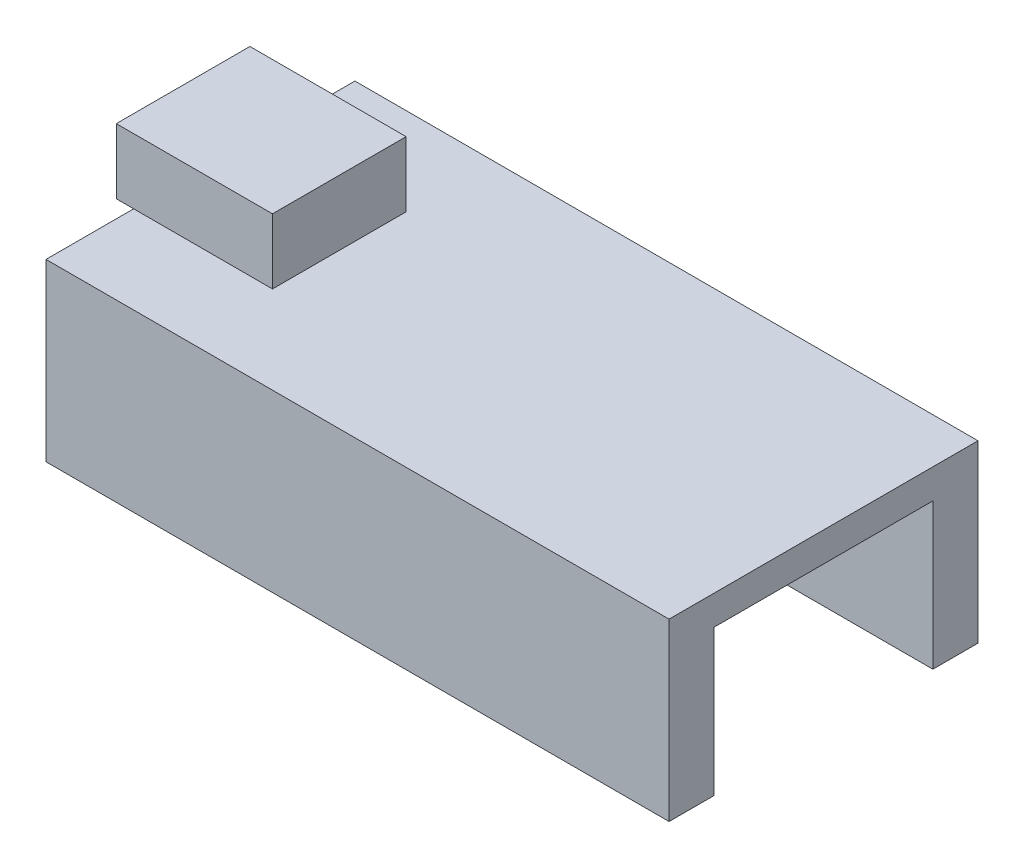
ISO-10303-21;
HEADER;
FILE_DESCRIPTION(('STEP AP214'),'2;1');
FILE_NAME('part.step','',(''),(''),'','','');
FILE_SCHEMA(('AUTOMOTIVE_DESIGN { 1 0 10303 214 1 1 1 1 }'));
ENDSEC;
DATA;
#1=APPLICATION_CONTEXT('core data for automotive mechanical design processes');
#2=APPLICATION_PROTOCOL_DEFINITION('international standard','automotive_design',2000,#1);
#3=PRODUCT_CONTEXT('',#1,'mechanical');
#4=PRODUCT('Part','Part','',(#3));
#5=PRODUCT_RELATED_PRODUCT_CATEGORY('part','',(#4));
#6=PRODUCT_DEFINITION_FORMATION('','',#4);
#7=PRODUCT_DEFINITION_CONTEXT('part definition',#1,'design');
#8=PRODUCT_DEFINITION('design','',#6,#7);
#9=PRODUCT_DEFINITION_SHAPE('','',#8);
#10=(LENGTH_UNIT() NAMED_UNIT(*) SI_UNIT(.MILLI.,.METRE.));
#11=(NAMED_UNIT(*) PLANE_ANGLE_UNIT() SI_UNIT($,.RADIAN.));
#12=(NAMED_UNIT(*) SI_UNIT($,.STERADIAN.) SOLID_ANGLE_UNIT());
#13=UNCERTAINTY_MEASURE_WITH_UNIT(LENGTH_MEASURE(1.E-05),#10,'distance_accuracy_value','');
#14=(GEOMETRIC_REPRESENTATION_CONTEXT(3) GLOBAL_UNCERTAINTY_ASSIGNED_CONTEXT((#13)) GLOBAL_UNIT_ASSIGNED_CONTEXT((#10,
#11,#12)) REPRESENTATION_CONTEXT('',''));
#15=CARTESIAN_POINT('',(0.,0.,0.));
#16=DIRECTION('',(0.,0.,1.));
#17=DIRECTION('',(1.,0.,0.));
#18=AXIS2_PLACEMENT_3D('',#15,#16,#17);
#19=CARTESIAN_POINT('',(-56.7067842729913,0.,-11.8636228267219));
#20=DIRECTION('',(0.,1.,0.));
#21=DIRECTION('',(0.,0.,1.));
#22=AXIS2_PLACEMENT_3D('',#19,#20,#21);
#23=PLANE('',#22);
#24=DIRECTION('',(-1.,0.,0.));
#25=VECTOR('',#24,1.);
#26=CARTESIAN_POINT('',(-56.7067842729913,0.,-27.0636228267219));
#27=LINE('',#26,#25);
#28=CARTESIAN_POINT('',(-20.8067842729913,0.,-27.0636228267219));
#29=VERTEX_POINT('',#28);
#30=CARTESIAN_POINT('',(-56.7067842729913,0.,-27.0636228267219));
#31=VERTEX_POINT('',#30);
#32=EDGE_CURVE('E153',#29,#31,#27,.T.);
#33=ORIENTED_EDGE('',*,*,#32,.F.);
#34=DIRECTION('',(0.,0.,-1.));
#35=VECTOR('',#34,1.);
#36=CARTESIAN_POINT('',(-20.8067842729913,0.,-29.6636228267219));
#37=LINE('',#36,#35);
#38=CARTESIAN_POINT('',(-20.8067842729913,0.,-14.4636228267219));
#39=VERTEX_POINT('',#38);
#40=EDGE_CURVE('E184',#39,#29,#37,.T.);
#41=ORIENTED_EDGE('',*,*,#40,.F.);
#42=DIRECTION('',(1.,0.,0.));
#43=VECTOR('',#42,1.);
#44=CARTESIAN_POINT('',(-56.7067842729913,0.,-14.4636228267219));
#45=LINE('',#44,#43);
#46=CARTESIAN_POINT('',(-56.7067842729913,0.,-14.4636228267219));
#47=VERTEX_POINT('',#46);
#48=EDGE_CURVE('E163',#47,#39,#45,.T.);
#49=ORIENTED_EDGE('',*,*,#48,.F.);
#50=DIRECTION('',(0.,0.,1.));
#51=VECTOR('',#50,1.);
#52=CARTESIAN_POINT('',(-56.7067842729913,0.,-29.6636228267219));
#53=LINE('',#52,#51);
#54=EDGE_CURVE('E34',#31,#47,#53,.T.);
#55=ORIENTED_EDGE('',*,*,#54,.F.);
#56=EDGE_LOOP('',(#33,#41,#49,#55));
#57=FACE_BOUND('',#56,.T.);
#58=ADVANCED_FACE('F30',(#57),#23,.F.);
#59=CARTESIAN_POINT('',(-56.7067842729913,1.7,-29.6636228267219));
#60=DIRECTION('',(1.,0.,0.));
#61=DIRECTION('',(0.,0.,-1.));
#62=AXIS2_PLACEMENT_3D('',#59,#60,#61);
#63=PLANE('',#62);
#64=DIRECTION('',(0.,-1.,0.));
#65=VECTOR('',#64,1.);
#66=CARTESIAN_POINT('',(-56.7067842729913,1.7,-29.6636228267219));
#67=LINE('',#66,#65);
#68=CARTESIAN_POINT('',(-56.7067842729913,1.7,-29.6636228267219));
#69=VERTEX_POINT('',#68);
#70=CARTESIAN_POINT('',(-56.7067842729913,-8.4,-29.6636228267219));
#71=VERTEX_POINT('',#70);
#72=EDGE_CURVE('E131',#69,#71,#67,.T.);
#73=ORIENTED_EDGE('',*,*,#72,.T.);
#74=DIRECTION('',(0.,0.,-1.));
#75=VECTOR('',#74,1.);
#76=CARTESIAN_POINT('',(-56.7067842729913,-8.4,-29.6636228267219));
#77=LINE('',#76,#75);
#78=CARTESIAN_POINT('',(-56.7067842729913,-8.4,-27.0636228267219));
#79=VERTEX_POINT('',#78);
#80=EDGE_CURVE('E134',#79,#71,#77,.T.);
#81=ORIENTED_EDGE('',*,*,#80,.F.);
#82=DIRECTION('',(0.,1.,0.));
#83=VECTOR('',#82,1.);
#84=CARTESIAN_POINT('',(-56.7067842729913,-8.4,-27.0636228267219));
#85=LINE('',#84,#83);
#86=EDGE_CURVE('E158',#79,#31,#85,.T.);
#87=ORIENTED_EDGE('',*,*,#86,.T.);
#88=ORIENTED_EDGE('',*,*,#54,.T.);
#89=DIRECTION('',(0.,1.,0.));
#90=VECTOR('',#89,1.);
#91=CARTESIAN_POINT('',(-56.7067842729913,-8.4,-14.4636228267219));
#92=LINE('',#91,#90);
#93=CARTESIAN_POINT('',(-56.7067842729913,-8.4,-14.4636228267219));
#94=VERTEX_POINT('',#93);
#95=EDGE_CURVE('E189',#94,#47,#92,.T.);
#96=ORIENTED_EDGE('',*,*,#95,.F.);
#97=DIRECTION('',(0.,0.,-1.));
#98=VECTOR('',#97,1.);
#99=CARTESIAN_POINT('',(-56.7067842729913,-8.4,-11.8636228267219));
#100=LINE('',#99,#98);
#101=CARTESIAN_POINT('',(-56.7067842729913,-8.4,-11.8636228267219));
#102=VERTEX_POINT('',#101);
#103=EDGE_CURVE('E164',#102,#94,#100,.T.);
#104=ORIENTED_EDGE('',*,*,#103,.F.);
#105=DIRECTION('',(0.,-1.,0.));
#106=VECTOR('',#105,1.);
#107=CARTESIAN_POINT('',(-56.7067842729913,1.7,-11.8636228267219));
#108=LINE('',#107,#106);
#109=CARTESIAN_POINT('',(-56.7067842729913,1.7,-11.8636228267219));
#110=VERTEX_POINT('',#109);
#111=EDGE_CURVE('E40',#110,#102,#108,.T.);
#112=ORIENTED_EDGE('',*,*,#111,.F.);
#113=DIRECTION('',(0.,0.,1.));
#114=VECTOR('',#113,1.);
#115=CARTESIAN_POINT('',(-56.7067842729913,1.7,-29.6636228267219));
#116=LINE('',#115,#114);
#117=CARTESIAN_POINT('',(-56.7067842729913,1.7,-16.9136228267219));
#118=VERTEX_POINT('',#117);
#119=EDGE_CURVE('E225',#118,#110,#116,.T.);
#120=ORIENTED_EDGE('',*,*,#119,.F.);
#121=CARTESIAN_POINT('',(-56.7067842729913,1.7,-24.6136228267219));
#122=VERTEX_POINT('',#121);
#123=EDGE_CURVE('E224',#122,#118,#116,.T.);
#124=ORIENTED_EDGE('',*,*,#123,.F.);
#125=EDGE_CURVE('E135',#69,#122,#116,.T.);
#126=ORIENTED_EDGE('',*,*,#125,.F.);
#127=EDGE_LOOP('',(#73,#81,#87,#88,#96,#104,#112,#120,#124,#126));
#128=FACE_BOUND('',#127,.T.);
#129=ADVANCED_FACE('F32',(#128),#63,.F.);
#130=CARTESIAN_POINT('',(-56.7067842729913,1.7,-11.8636228267219));
#131=DIRECTION('',(0.,0.,-1.));
#132=DIRECTION('',(-1.,0.,0.));
#133=AXIS2_PLACEMENT_3D('',#130,#131,#132);
#134=PLANE('',#133);
#135=ORIENTED_EDGE('',*,*,#111,.T.);
#136=DIRECTION('',(-1.,0.,0.));
#137=VECTOR('',#136,1.);
#138=CARTESIAN_POINT('',(-56.7067842729913,-8.4,-11.8636228267219));
#139=LINE('',#138,#137);
#140=CARTESIAN_POINT('',(-20.8067842729913,-8.4,-11.8636228267219));
#141=VERTEX_POINT('',#140);
#142=EDGE_CURVE('E172',#141,#102,#139,.T.);
#143=ORIENTED_EDGE('',*,*,#142,.F.);
#144=DIRECTION('',(0.,-1.,0.));
#145=VECTOR('',#144,1.);
#146=CARTESIAN_POINT('',(-20.8067842729913,1.7,-11.8636228267219));
#147=LINE('',#146,#145);
#148=CARTESIAN_POINT('',(-20.8067842729913,1.7,-11.8636228267219));
#149=VERTEX_POINT('',#148);
#150=EDGE_CURVE('E233',#149,#141,#147,.T.);
#151=ORIENTED_EDGE('',*,*,#150,.F.);
#152=DIRECTION('',(1.,0.,0.));
#153=VECTOR('',#152,1.);
#154=CARTESIAN_POINT('',(-56.7067842729913,1.7,-11.8636228267219));
#155=LINE('',#154,#153);
#156=EDGE_CURVE('E223',#110,#149,#155,.T.);
#157=ORIENTED_EDGE('',*,*,#156,.F.);
#158=EDGE_LOOP('',(#135,#143,#151,#157));
#159=FACE_BOUND('',#158,.T.);
#160=ADVANCED_FACE('F238',(#159),#134,.F.);
#161=CARTESIAN_POINT('',(-20.8067842729913,1.7,-29.6636228267219));
#162=DIRECTION('',(-1.,0.,0.));
#163=DIRECTION('',(0.,0.,1.));
#164=AXIS2_PLACEMENT_3D('',#161,#162,#163);
#165=PLANE('',#164);
#166=ORIENTED_EDGE('',*,*,#150,.T.);
#167=DIRECTION('',(0.,0.,1.));
#168=VECTOR('',#167,1.);
#169=CARTESIAN_POINT('',(-20.8067842729913,-8.4,-11.8636228267219));
#170=LINE('',#169,#168);
#171=CARTESIAN_POINT('',(-20.8067842729913,-8.4,-14.4636228267219));
#172=VERTEX_POINT('',#171);
#173=EDGE_CURVE('E169',#172,#141,#170,.T.);
#174=ORIENTED_EDGE('',*,*,#173,.F.);
#175=DIRECTION('',(0.,1.,0.));
#176=VECTOR('',#175,1.);
#177=CARTESIAN_POINT('',(-20.8067842729913,-8.4,-14.4636228267219));
#178=LINE('',#177,#176);
#179=EDGE_CURVE('E175',#172,#39,#178,.T.);
#180=ORIENTED_EDGE('',*,*,#179,.T.);
#181=ORIENTED_EDGE('',*,*,#40,.T.);
#182=DIRECTION('',(0.,1.,0.));
#183=VECTOR('',#182,1.);
#184=CARTESIAN_POINT('',(-20.8067842729913,-8.4,-27.0636228267219));
#185=LINE('',#184,#183);
#186=CARTESIAN_POINT('',(-20.8067842729913,-8.4,-27.0636228267219));
#187=VERTEX_POINT('',#186);
#188=EDGE_CURVE('E161',#187,#29,#185,.T.);
#189=ORIENTED_EDGE('',*,*,#188,.F.);
#190=DIRECTION('',(0.,0.,1.));
#191=VECTOR('',#190,1.);
#192=CARTESIAN_POINT('',(-20.8067842729913,-8.4,-29.6636228267219));
#193=LINE('',#192,#191);
#194=CARTESIAN_POINT('',(-20.8067842729913,-8.4,-29.6636228267219));
#195=VERTEX_POINT('',#194);
#196=EDGE_CURVE('E147',#195,#187,#193,.T.);
#197=ORIENTED_EDGE('',*,*,#196,.F.);
#198=DIRECTION('',(0.,-1.,0.));
#199=VECTOR('',#198,1.);
#200=CARTESIAN_POINT('',(-20.8067842729913,1.7,-29.6636228267219));
#201=LINE('',#200,#199);
#202=CARTESIAN_POINT('',(-20.8067842729913,1.7,-29.6636228267219));
#203=VERTEX_POINT('',#202);
#204=EDGE_CURVE('E138',#203,#195,#201,.T.);
#205=ORIENTED_EDGE('',*,*,#204,.F.);
#206=DIRECTION('',(0.,0.,-1.));
#207=VECTOR('',#206,1.);
#208=CARTESIAN_POINT('',(-20.8067842729913,1.7,-29.6636228267219));
#209=LINE('',#208,#207);
#210=EDGE_CURVE('E227',#149,#203,#209,.T.);
#211=ORIENTED_EDGE('',*,*,#210,.F.);
#212=EDGE_LOOP('',(#166,#174,#180,#181,#189,#197,#205,#211));
#213=FACE_BOUND('',#212,.T.);
#214=ADVANCED_FACE('F247',(#213),#165,.F.);
#215=CARTESIAN_POINT('',(-56.7067842729913,1.7,-29.6636228267219));
#216=DIRECTION('',(0.,0.,1.));
#217=DIRECTION('',(1.,0.,0.));
#218=AXIS2_PLACEMENT_3D('',#215,#216,#217);
#219=PLANE('',#218);
#220=ORIENTED_EDGE('',*,*,#204,.T.);
#221=DIRECTION('',(1.,0.,0.));
#222=VECTOR('',#221,1.);
#223=CARTESIAN_POINT('',(-56.7067842729913,-8.4,-29.6636228267219));
#224=LINE('',#223,#222);
#225=EDGE_CURVE('E142',#71,#195,#224,.T.);
#226=ORIENTED_EDGE('',*,*,#225,.F.);
#227=ORIENTED_EDGE('',*,*,#72,.F.);
#228=DIRECTION('',(-1.,0.,0.));
#229=VECTOR('',#228,1.);
#230=CARTESIAN_POINT('',(-56.7067842729913,1.7,-29.6636228267219));
#231=LINE('',#230,#229);
#232=EDGE_CURVE('E139',#203,#69,#231,.T.);
#233=ORIENTED_EDGE('',*,*,#232,.F.);
#234=EDGE_LOOP('',(#220,#226,#227,#233));
#235=FACE_BOUND('',#234,.T.);
#236=ADVANCED_FACE('F143',(#235),#219,.F.);
#237=CARTESIAN_POINT('',(-56.7067842729913,1.7,-11.8636228267219));
#238=DIRECTION('',(0.,1.,0.));
#239=DIRECTION('',(0.,0.,1.));
#240=AXIS2_PLACEMENT_3D('',#237,#238,#239);
#241=PLANE('',#240);
#242=DIRECTION('',(-1.,0.,0.));
#243=VECTOR('',#242,1.);
#244=CARTESIAN_POINT('',(-57.7067842729913,1.7,-24.6136228267219));
#245=LINE('',#244,#243);
#246=CARTESIAN_POINT('',(-48.7067842729913,1.7,-24.6136228267219));
#247=VERTEX_POINT('',#246);
#248=EDGE_CURVE('E56',#247,#122,#245,.T.);
#249=ORIENTED_EDGE('',*,*,#248,.F.);
#250=DIRECTION('',(0.,0.,-1.));
#251=VECTOR('',#250,1.);
#252=CARTESIAN_POINT('',(-48.7067842729913,1.7,-24.6136228267219));
#253=LINE('',#252,#251);
#254=CARTESIAN_POINT('',(-48.7067842729913,1.7,-16.9136228267219));
#255=VERTEX_POINT('',#254);
#256=EDGE_CURVE('E203',#255,#247,#253,.T.);
#257=ORIENTED_EDGE('',*,*,#256,.F.);
#258=DIRECTION('',(1.,0.,0.));
#259=VECTOR('',#258,1.);
#260=CARTESIAN_POINT('',(-57.7067842729913,1.7,-16.9136228267219));
#261=LINE('',#260,#259);
#262=EDGE_CURVE('E11',#118,#255,#261,.T.);
#263=ORIENTED_EDGE('',*,*,#262,.F.);
#264=ORIENTED_EDGE('',*,*,#119,.T.);
#265=ORIENTED_EDGE('',*,*,#156,.T.);
#266=ORIENTED_EDGE('',*,*,#210,.T.);
#267=ORIENTED_EDGE('',*,*,#232,.T.);
#268=ORIENTED_EDGE('',*,*,#125,.T.);
#269=EDGE_LOOP('',(#249,#257,#263,#264,#265,#266,#267,#268));
#270=FACE_BOUND('',#269,.T.);
#271=ADVANCED_FACE('F250',(#270),#241,.T.);
#272=CARTESIAN_POINT('',(-57.7067842729913,1.7,-16.9136228267219));
#273=DIRECTION('',(0.,1.,0.));
#274=DIRECTION('',(0.,0.,1.));
#275=AXIS2_PLACEMENT_3D('',#272,#273,#274);
#276=PLANE('',#275);
#277=CARTESIAN_POINT('',(-57.7067842729913,1.7,-24.6136228267219));
#278=VERTEX_POINT('',#277);
#279=EDGE_CURVE('E209',#122,#278,#245,.T.);
#280=ORIENTED_EDGE('',*,*,#279,.F.);
#281=ORIENTED_EDGE('',*,*,#123,.T.);
#282=CARTESIAN_POINT('',(-57.7067842729913,1.7,-16.9136228267219));
#283=VERTEX_POINT('',#282);
#284=EDGE_CURVE('E42',#283,#118,#261,.T.);
#285=ORIENTED_EDGE('',*,*,#284,.F.);
#286=DIRECTION('',(0.,0.,1.));
#287=VECTOR('',#286,1.);
#288=CARTESIAN_POINT('',(-57.7067842729913,1.7,-24.6136228267219));
#289=LINE('',#288,#287);
#290=EDGE_CURVE('E193',#278,#283,#289,.T.);
#291=ORIENTED_EDGE('',*,*,#290,.F.);
#292=EDGE_LOOP('',(#280,#281,#285,#291));
#293=FACE_BOUND('',#292,.T.);
#294=ADVANCED_FACE('F298',(#293),#276,.F.);
#295=CARTESIAN_POINT('',(-57.7067842729913,5.45,-24.6136228267219));
#296=DIRECTION('',(1.,0.,0.));
#297=DIRECTION('',(0.,0.,-1.));
#298=AXIS2_PLACEMENT_3D('',#295,#296,#297);
#299=PLANE('',#298);
#300=ORIENTED_EDGE('',*,*,#290,.T.);
#301=DIRECTION('',(0.,-1.,0.));
#302=VECTOR('',#301,1.);
#303=CARTESIAN_POINT('',(-57.7067842729913,5.45,-16.9136228267219));
#304=LINE('',#303,#302);
#305=CARTESIAN_POINT('',(-57.7067842729913,5.45,-16.9136228267219));
#306=VERTEX_POINT('',#305);
#307=EDGE_CURVE('E219',#306,#283,#304,.T.);
#308=ORIENTED_EDGE('',*,*,#307,.F.);
#309=DIRECTION('',(0.,0.,1.));
#310=VECTOR('',#309,1.);
#311=CARTESIAN_POINT('',(-57.7067842729913,5.45,-24.6136228267219));
#312=LINE('',#311,#310);
#313=CARTESIAN_POINT('',(-57.7067842729913,5.45,-24.6136228267219));
#314=VERTEX_POINT('',#313);
#315=EDGE_CURVE('E178',#314,#306,#312,.T.);
#316=ORIENTED_EDGE('',*,*,#315,.F.);
#317=DIRECTION('',(0.,-1.,0.));
#318=VECTOR('',#317,1.);
#319=CARTESIAN_POINT('',(-57.7067842729913,5.45,-24.6136228267219));
#320=LINE('',#319,#318);
#321=EDGE_CURVE('E211',#314,#278,#320,.T.);
#322=ORIENTED_EDGE('',*,*,#321,.T.);
#323=EDGE_LOOP('',(#300,#308,#316,#322));
#324=FACE_BOUND('',#323,.T.);
#325=ADVANCED_FACE('F304',(#324),#299,.F.);
#326=CARTESIAN_POINT('',(-57.7067842729913,5.45,-16.9136228267219));
#327=DIRECTION('',(0.,0.,-1.));
#328=DIRECTION('',(-1.,0.,0.));
#329=AXIS2_PLACEMENT_3D('',#326,#327,#328);
#330=PLANE('',#329);
#331=ORIENTED_EDGE('',*,*,#284,.T.);
#332=ORIENTED_EDGE('',*,*,#262,.T.);
#333=DIRECTION('',(0.,-1.,0.));
#334=VECTOR('',#333,1.);
#335=CARTESIAN_POINT('',(-48.7067842729913,5.45,-16.9136228267219));
#336=LINE('',#335,#334);
#337=CARTESIAN_POINT('',(-48.7067842729913,5.45,-16.9136228267219));
#338=VERTEX_POINT('',#337);
#339=EDGE_CURVE('E216',#338,#255,#336,.T.);
#340=ORIENTED_EDGE('',*,*,#339,.F.);
#341=DIRECTION('',(1.,0.,0.));
#342=VECTOR('',#341,1.);
#343=CARTESIAN_POINT('',(-57.7067842729913,5.45,-16.9136228267219));
#344=LINE('',#343,#342);
#345=EDGE_CURVE('E420',#306,#338,#344,.T.);
#346=ORIENTED_EDGE('',*,*,#345,.F.);
#347=ORIENTED_EDGE('',*,*,#307,.T.);
#348=EDGE_LOOP('',(#331,#332,#340,#346,#347));
#349=FACE_BOUND('',#348,.T.);
#350=ADVANCED_FACE('F312',(#349),#330,.F.);
#351=CARTESIAN_POINT('',(-48.7067842729913,5.45,-24.6136228267219));
#352=DIRECTION('',(-1.,0.,0.));
#353=DIRECTION('',(0.,0.,1.));
#354=AXIS2_PLACEMENT_3D('',#351,#352,#353);
#355=PLANE('',#354);
#356=ORIENTED_EDGE('',*,*,#256,.T.);
#357=DIRECTION('',(0.,-1.,0.));
#358=VECTOR('',#357,1.);
#359=CARTESIAN_POINT('',(-48.7067842729913,5.45,-24.6136228267219));
#360=LINE('',#359,#358);
#361=CARTESIAN_POINT('',(-48.7067842729913,5.45,-24.6136228267219));
#362=VERTEX_POINT('',#361);
#363=EDGE_CURVE('E213',#362,#247,#360,.T.);
#364=ORIENTED_EDGE('',*,*,#363,.F.);
#365=DIRECTION('',(0.,0.,-1.));
#366=VECTOR('',#365,1.);
#367=CARTESIAN_POINT('',(-48.7067842729913,5.45,-24.6136228267219));
#368=LINE('',#367,#366);
#369=EDGE_CURVE('E418',#338,#362,#368,.T.);
#370=ORIENTED_EDGE('',*,*,#369,.F.);
#371=ORIENTED_EDGE('',*,*,#339,.T.);
#372=EDGE_LOOP('',(#356,#364,#370,#371));
#373=FACE_BOUND('',#372,.T.);
#374=ADVANCED_FACE('F318',(#373),#355,.F.);
#375=CARTESIAN_POINT('',(-57.7067842729913,5.45,-24.6136228267219));
#376=DIRECTION('',(0.,0.,1.));
#377=DIRECTION('',(1.,0.,0.));
#378=AXIS2_PLACEMENT_3D('',#375,#376,#377);
#379=PLANE('',#378);
#380=ORIENTED_EDGE('',*,*,#248,.T.);
#381=ORIENTED_EDGE('',*,*,#279,.T.);
#382=ORIENTED_EDGE('',*,*,#321,.F.);
#383=DIRECTION('',(-1.,0.,0.));
#384=VECTOR('',#383,1.);
#385=CARTESIAN_POINT('',(-57.7067842729913,5.45,-24.6136228267219));
#386=LINE('',#385,#384);
#387=EDGE_CURVE('E205',#362,#314,#386,.T.);
#388=ORIENTED_EDGE('',*,*,#387,.F.);
#389=ORIENTED_EDGE('',*,*,#363,.T.);
#390=EDGE_LOOP('',(#380,#381,#382,#388,#389));
#391=FACE_BOUND('',#390,.T.);
#392=ADVANCED_FACE('F265',(#391),#379,.F.);
#393=CARTESIAN_POINT('',(-57.7067842729913,5.45,-16.9136228267219));
#394=DIRECTION('',(0.,1.,0.));
#395=DIRECTION('',(0.,0.,1.));
#396=AXIS2_PLACEMENT_3D('',#393,#394,#395);
#397=PLANE('',#396);
#398=ORIENTED_EDGE('',*,*,#315,.T.);
#399=ORIENTED_EDGE('',*,*,#345,.T.);
#400=ORIENTED_EDGE('',*,*,#369,.T.);
#401=ORIENTED_EDGE('',*,*,#387,.T.);
#402=EDGE_LOOP('',(#398,#399,#400,#401));
#403=FACE_BOUND('',#402,.T.);
#404=ADVANCED_FACE('F257',(#403),#397,.T.);
#405=CARTESIAN_POINT('',(-56.7067842729913,-8.4,-14.4636228267219));
#406=DIRECTION('',(0.,0.,1.));
#407=DIRECTION('',(1.,0.,0.));
#408=AXIS2_PLACEMENT_3D('',#405,#406,#407);
#409=PLANE('',#408);
#410=ORIENTED_EDGE('',*,*,#48,.T.);
#411=ORIENTED_EDGE('',*,*,#179,.F.);
#412=DIRECTION('',(1.,0.,0.));
#413=VECTOR('',#412,1.);
#414=CARTESIAN_POINT('',(-56.7067842729913,-8.4,-14.4636228267219));
#415=LINE('',#414,#413);
#416=EDGE_CURVE('E167',#94,#172,#415,.T.);
#417=ORIENTED_EDGE('',*,*,#416,.F.);
#418=ORIENTED_EDGE('',*,*,#95,.T.);
#419=EDGE_LOOP('',(#410,#411,#417,#418));
#420=FACE_BOUND('',#419,.T.);
#421=ADVANCED_FACE('F255',(#420),#409,.F.);
#422=CARTESIAN_POINT('',(-56.7067842729913,-8.4,-14.4636228267219));
#423=DIRECTION('',(0.,-1.,0.));
#424=DIRECTION('',(0.,0.,-1.));
#425=AXIS2_PLACEMENT_3D('',#422,#423,#424);
#426=PLANE('',#425);
#427=ORIENTED_EDGE('',*,*,#103,.T.);
#428=ORIENTED_EDGE('',*,*,#416,.T.);
#429=ORIENTED_EDGE('',*,*,#173,.T.);
#430=ORIENTED_EDGE('',*,*,#142,.T.);
#431=EDGE_LOOP('',(#427,#428,#429,#430));
#432=FACE_BOUND('',#431,.T.);
#433=ADVANCED_FACE('F243',(#432),#426,.T.);
#434=CARTESIAN_POINT('',(-56.7067842729913,-8.4,-27.0636228267219));
#435=DIRECTION('',(0.,0.,-1.));
#436=DIRECTION('',(-1.,0.,0.));
#437=AXIS2_PLACEMENT_3D('',#434,#435,#436);
#438=PLANE('',#437);
#439=ORIENTED_EDGE('',*,*,#32,.T.);
#440=ORIENTED_EDGE('',*,*,#86,.F.);
#441=DIRECTION('',(-1.,0.,0.));
#442=VECTOR('',#441,1.);
#443=CARTESIAN_POINT('',(-56.7067842729913,-8.4,-27.0636228267219));
#444=LINE('',#443,#442);
#445=EDGE_CURVE('E151',#187,#79,#444,.T.);
#446=ORIENTED_EDGE('',*,*,#445,.F.);
#447=ORIENTED_EDGE('',*,*,#188,.T.);
#448=EDGE_LOOP('',(#439,#440,#446,#447));
#449=FACE_BOUND('',#448,.T.);
#450=ADVANCED_FACE('F263',(#449),#438,.F.);
#451=CARTESIAN_POINT('',(-56.7067842729913,-8.4,-27.0636228267219));
#452=DIRECTION('',(0.,1.,0.));
#453=DIRECTION('',(0.,0.,1.));
#454=AXIS2_PLACEMENT_3D('',#451,#452,#453);
#455=PLANE('',#454);
#456=ORIENTED_EDGE('',*,*,#80,.T.);
#457=ORIENTED_EDGE('',*,*,#225,.T.);
#458=ORIENTED_EDGE('',*,*,#196,.T.);
#459=ORIENTED_EDGE('',*,*,#445,.T.);
#460=EDGE_LOOP('',(#456,#457,#458,#459));
#461=FACE_BOUND('',#460,.T.);
#462=ADVANCED_FACE('F149',(#461),#455,.F.);
#463=CLOSED_SHELL('',(#58,#129,#160,#214,#236,#271,#294,#325,#350,#374,#392,#404,#421,#433,#450,#462));
#464=MANIFOLD_SOLID_BREP('B2',#463);
#465=ADVANCED_BREP_SHAPE_REPRESENTATION('',(#18,#464),#14);
#466=SHAPE_DEFINITION_REPRESENTATION(#9,#465);
ENDSEC;
END-ISO-10303-21;
